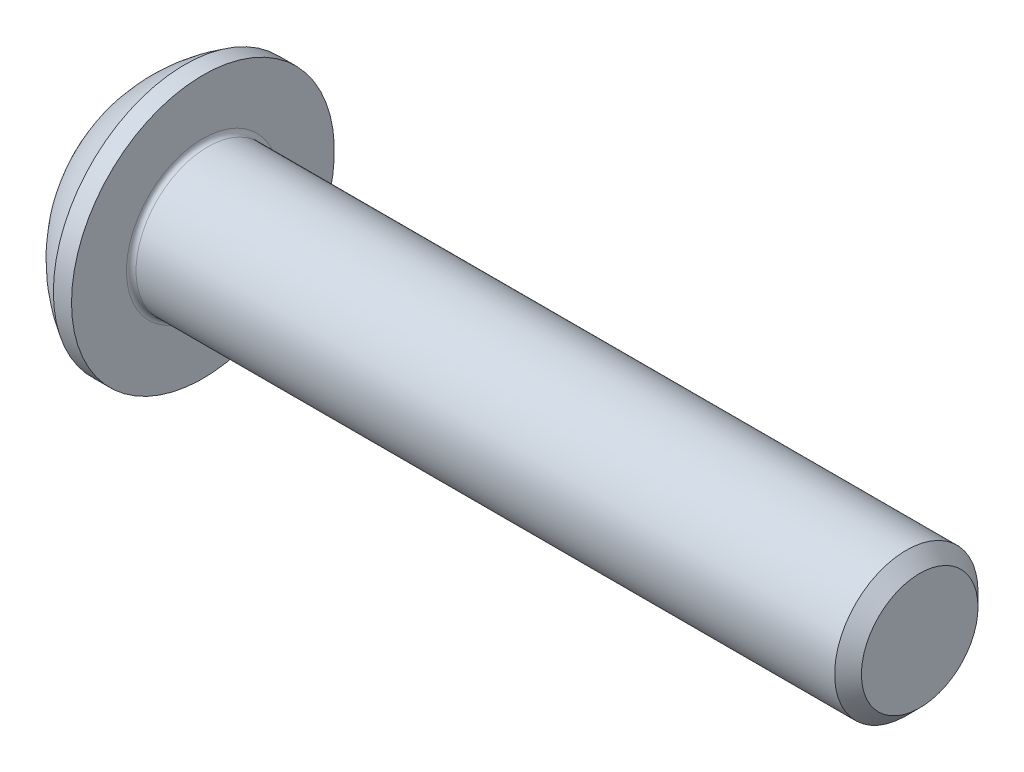
ISO-10303-21;
HEADER;
FILE_DESCRIPTION(('STEP AP214'),'2;1');
FILE_NAME('part.step','',(''),(''),'','','');
FILE_SCHEMA(('AUTOMOTIVE_DESIGN { 1 0 10303 214 1 1 1 1 }'));
ENDSEC;
DATA;
#1=APPLICATION_CONTEXT('core data for automotive mechanical design processes');
#2=APPLICATION_PROTOCOL_DEFINITION('international standard','automotive_design',2000,#1);
#3=PRODUCT_CONTEXT('',#1,'mechanical');
#4=PRODUCT('Part','Part','',(#3));
#5=PRODUCT_RELATED_PRODUCT_CATEGORY('part','',(#4));
#6=PRODUCT_DEFINITION_FORMATION('','',#4);
#7=PRODUCT_DEFINITION_CONTEXT('part definition',#1,'design');
#8=PRODUCT_DEFINITION('design','',#6,#7);
#9=PRODUCT_DEFINITION_SHAPE('','',#8);
#10=(LENGTH_UNIT() NAMED_UNIT(*) SI_UNIT(.MILLI.,.METRE.));
#11=(NAMED_UNIT(*) PLANE_ANGLE_UNIT() SI_UNIT($,.RADIAN.));
#12=(NAMED_UNIT(*) SI_UNIT($,.STERADIAN.) SOLID_ANGLE_UNIT());
#13=UNCERTAINTY_MEASURE_WITH_UNIT(LENGTH_MEASURE(1.E-05),#10,'distance_accuracy_value','');
#14=(GEOMETRIC_REPRESENTATION_CONTEXT(3) GLOBAL_UNCERTAINTY_ASSIGNED_CONTEXT((#13)) GLOBAL_UNIT_ASSIGNED_CONTEXT((#10,
#11,#12)) REPRESENTATION_CONTEXT('',''));
#15=CARTESIAN_POINT('',(0.,0.,0.));
#16=DIRECTION('',(0.,0.,1.));
#17=DIRECTION('',(1.,0.,0.));
#18=AXIS2_PLACEMENT_3D('',#15,#16,#17);
#19=CARTESIAN_POINT('',(1.04,0.,0.));
#20=DIRECTION('',(-1.,0.,0.));
#21=DIRECTION('',(0.,0.,1.));
#22=AXIS2_PLACEMENT_3D('',#19,#20,#21);
#23=PLANE('',#22);
#24=DIRECTION('',(0.,-1.,0.));
#25=VECTOR('',#24,1.);
#26=CARTESIAN_POINT('',(1.04,0.577350269189628,-1.));
#27=LINE('',#26,#25);
#28=CARTESIAN_POINT('',(1.04,0.577350269189628,-1.));
#29=VERTEX_POINT('',#28);
#30=CARTESIAN_POINT('',(1.04,0.,-1.));
#31=VERTEX_POINT('',#30);
#32=EDGE_CURVE('E254',#29,#31,#27,.T.);
#33=ORIENTED_EDGE('',*,*,#32,.T.);
#34=CARTESIAN_POINT('',(1.04,0.,0.));
#35=DIRECTION('',(1.,0.,0.));
#36=DIRECTION('',(0.,0.,-1.));
#37=AXIS2_PLACEMENT_3D('',#34,#35,#36);
#38=CIRCLE('',#37,0.999999999983859);
#39=CARTESIAN_POINT('',(1.04,0.866025403770461,-0.499999999991928));
#40=VERTEX_POINT('',#39);
#41=EDGE_CURVE('E50',#31,#40,#38,.T.);
#42=ORIENTED_EDGE('',*,*,#41,.T.);
#43=DIRECTION('',(0.,-0.499999999999999,-0.866025403784439));
#44=VECTOR('',#43,1.);
#45=CARTESIAN_POINT('',(1.04,1.15470053837925,0.));
#46=LINE('',#45,#44);
#47=EDGE_CURVE('E225',#40,#29,#46,.T.);
#48=ORIENTED_EDGE('',*,*,#47,.T.);
#49=EDGE_LOOP('',(#33,#42,#48));
#50=FACE_BOUND('',#49,.T.);
#51=ADVANCED_FACE('F35',(#50),#23,.T.);
#52=CARTESIAN_POINT('',(1.04,1.15470053837925,0.));
#53=VERTEX_POINT('',#52);
#54=EDGE_CURVE('E257',#53,#40,#46,.T.);
#55=ORIENTED_EDGE('',*,*,#54,.T.);
#56=CARTESIAN_POINT('',(1.04,0.866025403770461,0.499999999991928));
#57=VERTEX_POINT('',#56);
#58=EDGE_CURVE('E189',#40,#57,#38,.T.);
#59=ORIENTED_EDGE('',*,*,#58,.T.);
#60=DIRECTION('',(0.,0.499999999999999,-0.866025403784439));
#61=VECTOR('',#60,1.);
#62=CARTESIAN_POINT('',(1.04,0.577350269189628,1.));
#63=LINE('',#62,#61);
#64=EDGE_CURVE('E241',#57,#53,#63,.T.);
#65=ORIENTED_EDGE('',*,*,#64,.T.);
#66=EDGE_LOOP('',(#55,#59,#65));
#67=FACE_BOUND('',#66,.T.);
#68=ADVANCED_FACE('F125',(#67),#23,.T.);
#69=CARTESIAN_POINT('',(1.04,0.577350269189628,1.));
#70=VERTEX_POINT('',#69);
#71=EDGE_CURVE('E213',#70,#57,#63,.T.);
#72=ORIENTED_EDGE('',*,*,#71,.T.);
#73=CARTESIAN_POINT('',(1.04,0.,0.999999999983859));
#74=VERTEX_POINT('',#73);
#75=EDGE_CURVE('E193',#57,#74,#38,.T.);
#76=ORIENTED_EDGE('',*,*,#75,.T.);
#77=DIRECTION('',(0.,1.,0.));
#78=VECTOR('',#77,1.);
#79=CARTESIAN_POINT('',(1.04,-0.577350269189625,1.));
#80=LINE('',#79,#78);
#81=EDGE_CURVE('E245',#74,#70,#80,.T.);
#82=ORIENTED_EDGE('',*,*,#81,.T.);
#83=EDGE_LOOP('',(#72,#76,#82));
#84=FACE_BOUND('',#83,.T.);
#85=ADVANCED_FACE('F130',(#84),#23,.T.);
#86=CARTESIAN_POINT('',(1.04,-0.577350269189625,1.));
#87=VERTEX_POINT('',#86);
#88=EDGE_CURVE('E242',#87,#74,#80,.T.);
#89=ORIENTED_EDGE('',*,*,#88,.T.);
#90=CARTESIAN_POINT('',(1.04,-0.866025403770461,0.499999999991928));
#91=VERTEX_POINT('',#90);
#92=EDGE_CURVE('E263',#74,#91,#38,.T.);
#93=ORIENTED_EDGE('',*,*,#92,.T.);
#94=DIRECTION('',(0.,0.499999999999998,0.86602540378444));
#95=VECTOR('',#94,1.);
#96=CARTESIAN_POINT('',(1.04,-1.15470053837925,0.));
#97=LINE('',#96,#95);
#98=EDGE_CURVE('E249',#91,#87,#97,.T.);
#99=ORIENTED_EDGE('',*,*,#98,.T.);
#100=EDGE_LOOP('',(#89,#93,#99));
#101=FACE_BOUND('',#100,.T.);
#102=ADVANCED_FACE('F275',(#101),#23,.T.);
#103=CARTESIAN_POINT('',(1.04,-1.15470053837925,0.));
#104=VERTEX_POINT('',#103);
#105=EDGE_CURVE('E246',#104,#91,#97,.T.);
#106=ORIENTED_EDGE('',*,*,#105,.T.);
#107=CARTESIAN_POINT('',(1.04,-0.866025403770461,-0.499999999991927));
#108=VERTEX_POINT('',#107);
#109=EDGE_CURVE('E260',#91,#108,#38,.T.);
#110=ORIENTED_EDGE('',*,*,#109,.T.);
#111=DIRECTION('',(0.,-0.499999999999998,0.86602540378444));
#112=VECTOR('',#111,1.);
#113=CARTESIAN_POINT('',(1.04,-0.577350269189626,-1.));
#114=LINE('',#113,#112);
#115=EDGE_CURVE('E253',#108,#104,#114,.T.);
#116=ORIENTED_EDGE('',*,*,#115,.T.);
#117=EDGE_LOOP('',(#106,#110,#116));
#118=FACE_BOUND('',#117,.T.);
#119=ADVANCED_FACE('F123',(#118),#23,.T.);
#120=CARTESIAN_POINT('',(1.65,0.,0.));
#121=DIRECTION('',(-1.,0.,0.));
#122=DIRECTION('',(0.,0.,1.));
#123=AXIS2_PLACEMENT_3D('',#120,#121,#122);
#124=CYLINDRICAL_SURFACE('',#123,2.75);
#125=CARTESIAN_POINT('',(1.65,0.,0.));
#126=DIRECTION('',(-1.,0.,0.));
#127=DIRECTION('',(0.,0.,1.));
#128=AXIS2_PLACEMENT_3D('',#125,#126,#127);
#129=CIRCLE('',#128,2.75);
#130=CARTESIAN_POINT('',(1.65,0.,2.75));
#131=VERTEX_POINT('',#130);
#132=EDGE_CURVE('E196',#131,#131,#129,.T.);
#133=ORIENTED_EDGE('',*,*,#132,.T.);
#134=EDGE_LOOP('',(#133));
#135=FACE_BOUND('',#134,.T.);
#136=CARTESIAN_POINT('',(1.27,0.,0.));
#137=DIRECTION('',(-1.,0.,0.));
#138=DIRECTION('',(0.,0.,1.));
#139=AXIS2_PLACEMENT_3D('',#136,#137,#138);
#140=CIRCLE('',#139,2.75);
#141=CARTESIAN_POINT('',(1.27,0.,2.75));
#142=VERTEX_POINT('',#141);
#143=EDGE_CURVE('E206',#142,#142,#140,.T.);
#144=ORIENTED_EDGE('',*,*,#143,.F.);
#145=EDGE_LOOP('',(#144));
#146=FACE_BOUND('',#145,.T.);
#147=ADVANCED_FACE('F167',(#135,#146),#124,.T.);
#148=CARTESIAN_POINT('',(1.65,2.75,0.));
#149=DIRECTION('',(1.,0.,0.));
#150=DIRECTION('',(0.,0.,-1.));
#151=AXIS2_PLACEMENT_3D('',#148,#149,#150);
#152=PLANE('',#151);
#153=CARTESIAN_POINT('',(1.65,0.,0.));
#154=DIRECTION('',(1.,0.,0.));
#155=DIRECTION('',(0.,0.,-1.));
#156=AXIS2_PLACEMENT_3D('',#153,#154,#155);
#157=CIRCLE('',#156,1.6);
#158=CARTESIAN_POINT('',(1.65,0.,-1.6));
#159=VERTEX_POINT('',#158);
#160=EDGE_CURVE('E184',#159,#159,#157,.F.);
#161=ORIENTED_EDGE('',*,*,#160,.T.);
#162=EDGE_LOOP('',(#161));
#163=FACE_BOUND('',#162,.T.);
#164=ORIENTED_EDGE('',*,*,#132,.F.);
#165=EDGE_LOOP('',(#164));
#166=FACE_BOUND('',#165,.T.);
#167=ADVANCED_FACE('F163',(#163,#166),#152,.T.);
#168=CARTESIAN_POINT('',(0.,0.,0.));
#169=DIRECTION('',(-1.,0.,0.));
#170=DIRECTION('',(0.,0.,1.));
#171=AXIS2_PLACEMENT_3D('',#168,#169,#170);
#172=PLANE('',#171);
#173=DIRECTION('',(0.,-0.499999999999999,-0.866025403784439));
#174=VECTOR('',#173,1.);
#175=CARTESIAN_POINT('',(0.,1.15470053837925,0.));
#176=LINE('',#175,#174);
#177=CARTESIAN_POINT('',(0.,1.15470053837925,0.));
#178=VERTEX_POINT('',#177);
#179=CARTESIAN_POINT('',(0.,0.577350269189628,-1.));
#180=VERTEX_POINT('',#179);
#181=EDGE_CURVE('E58',#178,#180,#176,.T.);
#182=ORIENTED_EDGE('',*,*,#181,.F.);
#183=DIRECTION('',(0.,0.499999999999999,-0.866025403784439));
#184=VECTOR('',#183,1.);
#185=CARTESIAN_POINT('',(0.,0.577350269189628,1.));
#186=LINE('',#185,#184);
#187=CARTESIAN_POINT('',(0.,0.577350269189628,1.));
#188=VERTEX_POINT('',#187);
#189=EDGE_CURVE('E222',#188,#178,#186,.T.);
#190=ORIENTED_EDGE('',*,*,#189,.F.);
#191=DIRECTION('',(0.,1.,0.));
#192=VECTOR('',#191,1.);
#193=CARTESIAN_POINT('',(0.,-0.577350269189625,1.));
#194=LINE('',#193,#192);
#195=CARTESIAN_POINT('',(0.,-0.577350269189625,1.));
#196=VERTEX_POINT('',#195);
#197=EDGE_CURVE('E226',#196,#188,#194,.T.);
#198=ORIENTED_EDGE('',*,*,#197,.F.);
#199=DIRECTION('',(0.,0.499999999999998,0.86602540378444));
#200=VECTOR('',#199,1.);
#201=CARTESIAN_POINT('',(0.,-1.15470053837925,0.));
#202=LINE('',#201,#200);
#203=CARTESIAN_POINT('',(0.,-1.15470053837925,0.));
#204=VERTEX_POINT('',#203);
#205=EDGE_CURVE('E229',#204,#196,#202,.T.);
#206=ORIENTED_EDGE('',*,*,#205,.F.);
#207=DIRECTION('',(0.,-0.499999999999998,0.86602540378444));
#208=VECTOR('',#207,1.);
#209=CARTESIAN_POINT('',(0.,-0.577350269189626,-1.));
#210=LINE('',#209,#208);
#211=CARTESIAN_POINT('',(0.,-0.577350269189626,-1.));
#212=VERTEX_POINT('',#211);
#213=EDGE_CURVE('E232',#212,#204,#210,.T.);
#214=ORIENTED_EDGE('',*,*,#213,.F.);
#215=DIRECTION('',(0.,-1.,0.));
#216=VECTOR('',#215,1.);
#217=CARTESIAN_POINT('',(0.,0.577350269189628,-1.));
#218=LINE('',#217,#216);
#219=EDGE_CURVE('E235',#180,#212,#218,.T.);
#220=ORIENTED_EDGE('',*,*,#219,.F.);
#221=EDGE_LOOP('',(#182,#190,#198,#206,#214,#220));
#222=FACE_BOUND('',#221,.T.);
#223=CARTESIAN_POINT('',(0.,0.,0.));
#224=DIRECTION('',(-1.,0.,0.));
#225=DIRECTION('',(0.,0.,1.));
#226=AXIS2_PLACEMENT_3D('',#223,#224,#225);
#227=CIRCLE('',#226,1.425);
#228=CARTESIAN_POINT('',(0.,0.,1.425));
#229=VERTEX_POINT('',#228);
#230=EDGE_CURVE('E203',#229,#229,#227,.T.);
#231=ORIENTED_EDGE('',*,*,#230,.T.);
#232=EDGE_LOOP('',(#231));
#233=FACE_BOUND('',#232,.T.);
#234=ADVANCED_FACE('F159',(#222,#233),#172,.T.);
#235=CARTESIAN_POINT('',(2.96202427690375,0.,0.));
#236=DIRECTION('',(-1.,0.,0.));
#237=DIRECTION('',(0.,0.,1.));
#238=AXIS2_PLACEMENT_3D('',#235,#236,#237);
#239=DEGENERATE_TOROIDAL_SURFACE('',#238,0.14293081635303,3.35141684393879,.F.);
#240=ORIENTED_EDGE('',*,*,#143,.T.);
#241=EDGE_LOOP('',(#240));
#242=FACE_BOUND('',#241,.T.);
#243=ORIENTED_EDGE('',*,*,#230,.F.);
#244=EDGE_LOOP('',(#243));
#245=FACE_BOUND('',#244,.T.);
#246=ADVANCED_FACE('F156',(#242,#245),#239,.F.);
#247=CARTESIAN_POINT('',(1.04,1.15470053837925,0.));
#248=DIRECTION('',(0.,0.866025403784439,-0.499999999999999));
#249=DIRECTION('',(0.,0.499999999999999,0.866025403784439));
#250=AXIS2_PLACEMENT_3D('',#247,#248,#249);
#251=PLANE('',#250);
#252=ORIENTED_EDGE('',*,*,#181,.T.);
#253=DIRECTION('',(-1.,0.,0.));
#254=VECTOR('',#253,1.);
#255=CARTESIAN_POINT('',(1.04,0.577350269189628,-1.));
#256=LINE('',#255,#254);
#257=EDGE_CURVE('E210',#29,#180,#256,.T.);
#258=ORIENTED_EDGE('',*,*,#257,.F.);
#259=ORIENTED_EDGE('',*,*,#47,.F.);
#260=ORIENTED_EDGE('',*,*,#54,.F.);
#261=DIRECTION('',(-1.,0.,0.));
#262=VECTOR('',#261,1.);
#263=CARTESIAN_POINT('',(1.04,1.15470053837925,0.));
#264=LINE('',#263,#262);
#265=EDGE_CURVE('E209',#53,#178,#264,.T.);
#266=ORIENTED_EDGE('',*,*,#265,.T.);
#267=EDGE_LOOP('',(#252,#258,#259,#260,#266));
#268=FACE_BOUND('',#267,.T.);
#269=ADVANCED_FACE('F138',(#268),#251,.F.);
#270=CARTESIAN_POINT('',(1.04,0.577350269189628,1.));
#271=DIRECTION('',(0.,0.866025403784439,0.499999999999999));
#272=DIRECTION('',(0.,-0.499999999999999,0.866025403784439));
#273=AXIS2_PLACEMENT_3D('',#270,#271,#272);
#274=PLANE('',#273);
#275=ORIENTED_EDGE('',*,*,#189,.T.);
#276=ORIENTED_EDGE('',*,*,#265,.F.);
#277=ORIENTED_EDGE('',*,*,#64,.F.);
#278=ORIENTED_EDGE('',*,*,#71,.F.);
#279=DIRECTION('',(-1.,0.,0.));
#280=VECTOR('',#279,1.);
#281=CARTESIAN_POINT('',(1.04,0.577350269189628,1.));
#282=LINE('',#281,#280);
#283=EDGE_CURVE('E219',#70,#188,#282,.T.);
#284=ORIENTED_EDGE('',*,*,#283,.T.);
#285=EDGE_LOOP('',(#275,#276,#277,#278,#284));
#286=FACE_BOUND('',#285,.T.);
#287=ADVANCED_FACE('F134',(#286),#274,.F.);
#288=CARTESIAN_POINT('',(1.04,-0.577350269189625,1.));
#289=DIRECTION('',(0.,0.,1.));
#290=DIRECTION('',(1.,0.,0.));
#291=AXIS2_PLACEMENT_3D('',#288,#289,#290);
#292=PLANE('',#291);
#293=ORIENTED_EDGE('',*,*,#197,.T.);
#294=ORIENTED_EDGE('',*,*,#283,.F.);
#295=ORIENTED_EDGE('',*,*,#81,.F.);
#296=ORIENTED_EDGE('',*,*,#88,.F.);
#297=DIRECTION('',(-1.,0.,0.));
#298=VECTOR('',#297,1.);
#299=CARTESIAN_POINT('',(1.04,-0.577350269189625,1.));
#300=LINE('',#299,#298);
#301=EDGE_CURVE('E217',#87,#196,#300,.T.);
#302=ORIENTED_EDGE('',*,*,#301,.T.);
#303=EDGE_LOOP('',(#293,#294,#295,#296,#302));
#304=FACE_BOUND('',#303,.T.);
#305=ADVANCED_FACE('F137',(#304),#292,.F.);
#306=CARTESIAN_POINT('',(1.04,-1.15470053837925,0.));
#307=DIRECTION('',(0.,-0.86602540378444,0.499999999999998));
#308=DIRECTION('',(0.,-0.499999999999998,-0.86602540378444));
#309=AXIS2_PLACEMENT_3D('',#306,#307,#308);
#310=PLANE('',#309);
#311=ORIENTED_EDGE('',*,*,#205,.T.);
#312=ORIENTED_EDGE('',*,*,#301,.F.);
#313=ORIENTED_EDGE('',*,*,#98,.F.);
#314=ORIENTED_EDGE('',*,*,#105,.F.);
#315=DIRECTION('',(-1.,0.,0.));
#316=VECTOR('',#315,1.);
#317=CARTESIAN_POINT('',(1.04,-1.15470053837925,0.));
#318=LINE('',#317,#316);
#319=EDGE_CURVE('E215',#104,#204,#318,.T.);
#320=ORIENTED_EDGE('',*,*,#319,.T.);
#321=EDGE_LOOP('',(#311,#312,#313,#314,#320));
#322=FACE_BOUND('',#321,.T.);
#323=ADVANCED_FACE('F142',(#322),#310,.F.);
#324=CARTESIAN_POINT('',(1.04,-0.577350269189626,-1.));
#325=DIRECTION('',(0.,-0.86602540378444,-0.499999999999998));
#326=DIRECTION('',(0.,0.499999999999998,-0.86602540378444));
#327=AXIS2_PLACEMENT_3D('',#324,#325,#326);
#328=PLANE('',#327);
#329=ORIENTED_EDGE('',*,*,#213,.T.);
#330=ORIENTED_EDGE('',*,*,#319,.F.);
#331=ORIENTED_EDGE('',*,*,#115,.F.);
#332=CARTESIAN_POINT('',(1.04,-0.577350269189626,-1.));
#333=VERTEX_POINT('',#332);
#334=EDGE_CURVE('E250',#333,#108,#114,.T.);
#335=ORIENTED_EDGE('',*,*,#334,.F.);
#336=DIRECTION('',(-1.,0.,0.));
#337=VECTOR('',#336,1.);
#338=CARTESIAN_POINT('',(1.04,-0.577350269189626,-1.));
#339=LINE('',#338,#337);
#340=EDGE_CURVE('E212',#333,#212,#339,.T.);
#341=ORIENTED_EDGE('',*,*,#340,.T.);
#342=EDGE_LOOP('',(#329,#330,#331,#335,#341));
#343=FACE_BOUND('',#342,.T.);
#344=ADVANCED_FACE('F146',(#343),#328,.F.);
#345=CARTESIAN_POINT('',(1.04,0.577350269189628,-1.));
#346=DIRECTION('',(0.,0.,-1.));
#347=DIRECTION('',(-1.,0.,0.));
#348=AXIS2_PLACEMENT_3D('',#345,#346,#347);
#349=PLANE('',#348);
#350=ORIENTED_EDGE('',*,*,#219,.T.);
#351=ORIENTED_EDGE('',*,*,#340,.F.);
#352=EDGE_CURVE('E256',#31,#333,#27,.T.);
#353=ORIENTED_EDGE('',*,*,#352,.F.);
#354=ORIENTED_EDGE('',*,*,#32,.F.);
#355=ORIENTED_EDGE('',*,*,#257,.T.);
#356=EDGE_LOOP('',(#350,#351,#353,#354,#355));
#357=FACE_BOUND('',#356,.T.);
#358=ADVANCED_FACE('F120',(#357),#349,.F.);
#359=ORIENTED_EDGE('',*,*,#334,.T.);
#360=EDGE_CURVE('E202',#108,#31,#38,.T.);
#361=ORIENTED_EDGE('',*,*,#360,.T.);
#362=ORIENTED_EDGE('',*,*,#352,.T.);
#363=EDGE_LOOP('',(#359,#361,#362));
#364=FACE_BOUND('',#363,.T.);
#365=ADVANCED_FACE('F111',(#364),#23,.T.);
#366=CARTESIAN_POINT('',(1.61735026918031,0.,0.));
#367=DIRECTION('',(-1.,0.,0.));
#368=DIRECTION('',(0.,0.,1.));
#369=AXIS2_PLACEMENT_3D('',#366,#367,#368);
#370=CONICAL_SURFACE('',#369,0.,1.0471975511966);
#371=ORIENTED_EDGE('',*,*,#41,.F.);
#372=ORIENTED_EDGE('',*,*,#360,.F.);
#373=ORIENTED_EDGE('',*,*,#109,.F.);
#374=ORIENTED_EDGE('',*,*,#92,.F.);
#375=ORIENTED_EDGE('',*,*,#75,.F.);
#376=ORIENTED_EDGE('',*,*,#58,.F.);
#377=EDGE_LOOP('',(#371,#372,#373,#374,#375,#376));
#378=FACE_BOUND('',#377,.T.);
#379=CARTESIAN_POINT('',(1.61735026918031,0.,0.));
#380=VERTEX_POINT('',#379);
#381=VERTEX_LOOP('',#380);
#382=FACE_BOUND('',#381,.T.);
#383=ADVANCED_FACE('F108',(#378,#382),#370,.F.);
#384=CARTESIAN_POINT('',(16.65,0.,0.));
#385=DIRECTION('',(-1.,0.,0.));
#386=DIRECTION('',(0.,0.,1.));
#387=AXIS2_PLACEMENT_3D('',#384,#385,#386);
#388=CYLINDRICAL_SURFACE('',#387,1.5);
#389=CARTESIAN_POINT('',(16.3695,0.,0.));
#390=DIRECTION('',(1.,0.,0.));
#391=DIRECTION('',(0.,0.,-1.));
#392=AXIS2_PLACEMENT_3D('',#389,#390,#391);
#393=CIRCLE('',#392,1.5);
#394=CARTESIAN_POINT('',(16.3695,0.,-1.5));
#395=VERTEX_POINT('',#394);
#396=EDGE_CURVE('E11',#395,#395,#393,.F.);
#397=ORIENTED_EDGE('',*,*,#396,.T.);
#398=EDGE_LOOP('',(#397));
#399=FACE_BOUND('',#398,.T.);
#400=CARTESIAN_POINT('',(1.75,0.,0.));
#401=DIRECTION('',(1.,0.,0.));
#402=DIRECTION('',(0.,0.,-1.));
#403=AXIS2_PLACEMENT_3D('',#400,#401,#402);
#404=CIRCLE('',#403,1.5);
#405=CARTESIAN_POINT('',(1.75,0.,-1.5));
#406=VERTEX_POINT('',#405);
#407=EDGE_CURVE('E187',#406,#406,#404,.T.);
#408=ORIENTED_EDGE('',*,*,#407,.T.);
#409=EDGE_LOOP('',(#408));
#410=FACE_BOUND('',#409,.T.);
#411=ADVANCED_FACE('F110',(#399,#410),#388,.T.);
#412=CARTESIAN_POINT('',(16.65,0.,0.));
#413=DIRECTION('',(1.,0.,0.));
#414=DIRECTION('',(0.,0.,-1.));
#415=AXIS2_PLACEMENT_3D('',#412,#413,#414);
#416=PLANE('',#415);
#417=CARTESIAN_POINT('',(16.65,0.,0.));
#418=DIRECTION('',(1.,0.,0.));
#419=DIRECTION('',(0.,0.,-1.));
#420=AXIS2_PLACEMENT_3D('',#417,#418,#419);
#421=CIRCLE('',#420,1.2195);
#422=CARTESIAN_POINT('',(16.65,0.,-1.2195));
#423=VERTEX_POINT('',#422);
#424=EDGE_CURVE('E43',#423,#423,#421,.T.);
#425=ORIENTED_EDGE('',*,*,#424,.T.);
#426=EDGE_LOOP('',(#425));
#427=FACE_BOUND('',#426,.T.);
#428=ADVANCED_FACE('F117',(#427),#416,.T.);
#429=CARTESIAN_POINT('',(1.75,0.,0.));
#430=DIRECTION('',(1.,0.,0.));
#431=DIRECTION('',(0.,0.,-1.));
#432=AXIS2_PLACEMENT_3D('',#429,#430,#431);
#433=TOROIDAL_SURFACE('',#432,1.6,0.1);
#434=ORIENTED_EDGE('',*,*,#160,.F.);
#435=EDGE_LOOP('',(#434));
#436=FACE_BOUND('',#435,.T.);
#437=ORIENTED_EDGE('',*,*,#407,.F.);
#438=EDGE_LOOP('',(#437));
#439=FACE_BOUND('',#438,.T.);
#440=ADVANCED_FACE('F171',(#436,#439),#433,.F.);
#441=CARTESIAN_POINT('',(16.65,0.,0.));
#442=DIRECTION('',(-1.,0.,0.));
#443=DIRECTION('',(0.,0.,1.));
#444=AXIS2_PLACEMENT_3D('',#441,#442,#443);
#445=CONICAL_SURFACE('',#444,1.2195,0.785398163397443);
#446=ORIENTED_EDGE('',*,*,#396,.F.);
#447=EDGE_LOOP('',(#446));
#448=FACE_BOUND('',#447,.T.);
#449=ORIENTED_EDGE('',*,*,#424,.F.);
#450=EDGE_LOOP('',(#449));
#451=FACE_BOUND('',#450,.T.);
#452=ADVANCED_FACE('F37',(#448,#451),#445,.T.);
#453=CLOSED_SHELL('',(#51,#68,#85,#102,#119,#147,#167,#234,#246,#269,#287,#305,#323,#344,#358,
#365,#383,#411,#428,#440,#452));
#454=MANIFOLD_SOLID_BREP('B2',#453);
#455=ADVANCED_BREP_SHAPE_REPRESENTATION('',(#18,#454),#14);
#456=SHAPE_DEFINITION_REPRESENTATION(#9,#455);
ENDSEC;
END-ISO-10303-21;
